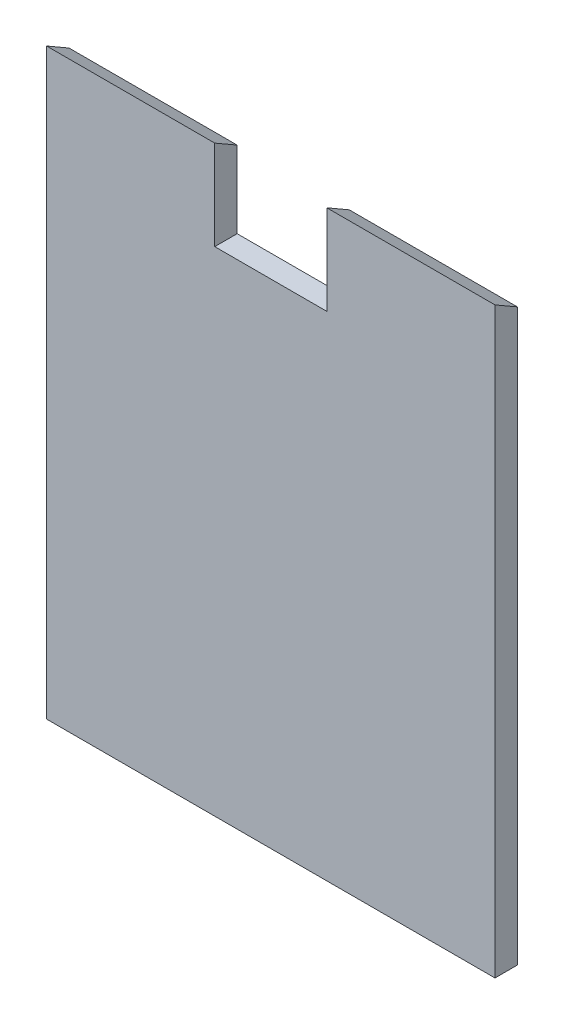
ISO-10303-21;
HEADER;
FILE_DESCRIPTION(('STEP AP214'),'2;1');
FILE_NAME('part.step','',(''),(''),'','','');
FILE_SCHEMA(('AUTOMOTIVE_DESIGN { 1 0 10303 214 1 1 1 1 }'));
ENDSEC;
DATA;
#1=APPLICATION_CONTEXT('core data for automotive mechanical design processes');
#2=APPLICATION_PROTOCOL_DEFINITION('international standard','automotive_design',2000,#1);
#3=PRODUCT_CONTEXT('',#1,'mechanical');
#4=PRODUCT('Part','Part','',(#3));
#5=PRODUCT_RELATED_PRODUCT_CATEGORY('part','',(#4));
#6=PRODUCT_DEFINITION_FORMATION('','',#4);
#7=PRODUCT_DEFINITION_CONTEXT('part definition',#1,'design');
#8=PRODUCT_DEFINITION('design','',#6,#7);
#9=PRODUCT_DEFINITION_SHAPE('','',#8);
#10=(LENGTH_UNIT() NAMED_UNIT(*) SI_UNIT(.MILLI.,.METRE.));
#11=(NAMED_UNIT(*) PLANE_ANGLE_UNIT() SI_UNIT($,.RADIAN.));
#12=(NAMED_UNIT(*) SI_UNIT($,.STERADIAN.) SOLID_ANGLE_UNIT());
#13=UNCERTAINTY_MEASURE_WITH_UNIT(LENGTH_MEASURE(1.E-05),#10,'distance_accuracy_value','');
#14=(GEOMETRIC_REPRESENTATION_CONTEXT(3) GLOBAL_UNCERTAINTY_ASSIGNED_CONTEXT((#13)) GLOBAL_UNIT_ASSIGNED_CONTEXT((#10,
#11,#12)) REPRESENTATION_CONTEXT('',''));
#15=CARTESIAN_POINT('',(0.,0.,0.));
#16=DIRECTION('',(0.,0.,1.));
#17=DIRECTION('',(1.,0.,0.));
#18=AXIS2_PLACEMENT_3D('',#15,#16,#17);
#19=CARTESIAN_POINT('',(-127.,-165.1,6.35));
#20=DIRECTION('',(1.,0.,0.));
#21=DIRECTION('',(0.,0.,-1.));
#22=AXIS2_PLACEMENT_3D('',#19,#20,#21);
#23=PLANE('',#22);
#24=DIRECTION('',(0.,-1.,0.));
#25=VECTOR('',#24,1.);
#26=CARTESIAN_POINT('',(-127.,-165.1,6.35));
#27=LINE('',#26,#25);
#28=CARTESIAN_POINT('',(-127.,165.1,6.35));
#29=VERTEX_POINT('',#28);
#30=CARTESIAN_POINT('',(-127.,-165.1,6.35));
#31=VERTEX_POINT('',#30);
#32=EDGE_CURVE('E107',#29,#31,#27,.T.);
#33=ORIENTED_EDGE('',*,*,#32,.F.);
#34=DIRECTION('',(0.,-0.500000000000001,-0.866025403784438));
#35=VECTOR('',#34,1.);
#36=CARTESIAN_POINT('',(-127.,165.1,6.35));
#37=LINE('',#36,#35);
#38=CARTESIAN_POINT('',(-127.,157.767651581292,-6.35000000000002));
#39=VERTEX_POINT('',#38);
#40=EDGE_CURVE('E96',#29,#39,#37,.T.);
#41=ORIENTED_EDGE('',*,*,#40,.T.);
#42=DIRECTION('',(0.,-1.,0.));
#43=VECTOR('',#42,1.);
#44=CARTESIAN_POINT('',(-127.,-165.1,-6.35));
#45=LINE('',#44,#43);
#46=CARTESIAN_POINT('',(-127.,-165.1,-6.35));
#47=VERTEX_POINT('',#46);
#48=EDGE_CURVE('E105',#39,#47,#45,.T.);
#49=ORIENTED_EDGE('',*,*,#48,.T.);
#50=DIRECTION('',(0.,0.,-1.));
#51=VECTOR('',#50,1.);
#52=CARTESIAN_POINT('',(-127.,-165.1,6.35));
#53=LINE('',#52,#51);
#54=EDGE_CURVE('E40',#31,#47,#53,.T.);
#55=ORIENTED_EDGE('',*,*,#54,.F.);
#56=EDGE_LOOP('',(#33,#41,#49,#55));
#57=FACE_BOUND('',#56,.T.);
#58=ADVANCED_FACE('F33',(#57),#23,.F.);
#59=CARTESIAN_POINT('',(127.,-165.1,6.35));
#60=DIRECTION('',(0.,1.,0.));
#61=DIRECTION('',(-1.,0.,0.));
#62=AXIS2_PLACEMENT_3D('',#59,#60,#61);
#63=PLANE('',#62);
#64=DIRECTION('',(1.,0.,0.));
#65=VECTOR('',#64,1.);
#66=CARTESIAN_POINT('',(127.,-165.1,-6.35));
#67=LINE('',#66,#65);
#68=CARTESIAN_POINT('',(127.,-165.1,-6.35));
#69=VERTEX_POINT('',#68);
#70=EDGE_CURVE('E113',#47,#69,#67,.T.);
#71=ORIENTED_EDGE('',*,*,#70,.T.);
#72=DIRECTION('',(0.,0.,-1.));
#73=VECTOR('',#72,1.);
#74=CARTESIAN_POINT('',(127.,-165.1,6.35));
#75=LINE('',#74,#73);
#76=CARTESIAN_POINT('',(127.,-165.1,6.35));
#77=VERTEX_POINT('',#76);
#78=EDGE_CURVE('E139',#77,#69,#75,.T.);
#79=ORIENTED_EDGE('',*,*,#78,.F.);
#80=DIRECTION('',(1.,0.,0.));
#81=VECTOR('',#80,1.);
#82=CARTESIAN_POINT('',(127.,-165.1,6.35));
#83=LINE('',#82,#81);
#84=EDGE_CURVE('E145',#31,#77,#83,.T.);
#85=ORIENTED_EDGE('',*,*,#84,.F.);
#86=ORIENTED_EDGE('',*,*,#54,.T.);
#87=EDGE_LOOP('',(#71,#79,#85,#86));
#88=FACE_BOUND('',#87,.T.);
#89=ADVANCED_FACE('F143',(#88),#63,.F.);
#90=CARTESIAN_POINT('',(127.,-165.1,6.35));
#91=DIRECTION('',(-1.,0.,0.));
#92=DIRECTION('',(0.,-1.,0.));
#93=AXIS2_PLACEMENT_3D('',#90,#91,#92);
#94=PLANE('',#93);
#95=DIRECTION('',(0.,1.,0.));
#96=VECTOR('',#95,1.);
#97=CARTESIAN_POINT('',(127.,-165.1,-6.35));
#98=LINE('',#97,#96);
#99=CARTESIAN_POINT('',(127.,157.767651581292,-6.35));
#100=VERTEX_POINT('',#99);
#101=EDGE_CURVE('E116',#69,#100,#98,.T.);
#102=ORIENTED_EDGE('',*,*,#101,.T.);
#103=DIRECTION('',(0.,-0.500000000000001,-0.866025403784438));
#104=VECTOR('',#103,1.);
#105=CARTESIAN_POINT('',(127.,165.1,6.35));
#106=LINE('',#105,#104);
#107=CARTESIAN_POINT('',(127.,165.1,6.35));
#108=VERTEX_POINT('',#107);
#109=EDGE_CURVE('E46',#108,#100,#106,.T.);
#110=ORIENTED_EDGE('',*,*,#109,.F.);
#111=DIRECTION('',(0.,1.,0.));
#112=VECTOR('',#111,1.);
#113=CARTESIAN_POINT('',(127.,-165.1,6.35));
#114=LINE('',#113,#112);
#115=EDGE_CURVE('E149',#77,#108,#114,.T.);
#116=ORIENTED_EDGE('',*,*,#115,.F.);
#117=ORIENTED_EDGE('',*,*,#78,.T.);
#118=EDGE_LOOP('',(#102,#110,#116,#117));
#119=FACE_BOUND('',#118,.T.);
#120=ADVANCED_FACE('F179',(#119),#94,.F.);
#121=CARTESIAN_POINT('',(31.75,114.3,6.35));
#122=DIRECTION('',(1.,0.,0.));
#123=DIRECTION('',(0.,1.,0.));
#124=AXIS2_PLACEMENT_3D('',#121,#122,#123);
#125=PLANE('',#124);
#126=DIRECTION('',(0.,-1.,0.));
#127=VECTOR('',#126,1.);
#128=CARTESIAN_POINT('',(31.75,114.3,6.35));
#129=LINE('',#128,#127);
#130=CARTESIAN_POINT('',(31.7499999999998,165.1,6.35));
#131=VERTEX_POINT('',#130);
#132=CARTESIAN_POINT('',(31.75,114.3,6.35));
#133=VERTEX_POINT('',#132);
#134=EDGE_CURVE('E158',#131,#133,#129,.T.);
#135=ORIENTED_EDGE('',*,*,#134,.F.);
#136=DIRECTION('',(0.,-0.500000000000001,-0.866025403784438));
#137=VECTOR('',#136,1.);
#138=CARTESIAN_POINT('',(31.7499999999999,152.4,-15.6470452561248));
#139=LINE('',#138,#137);
#140=CARTESIAN_POINT('',(31.7499999999999,157.767651581292,-6.35000000000002));
#141=VERTEX_POINT('',#140);
#142=EDGE_CURVE('E114',#131,#141,#139,.T.);
#143=ORIENTED_EDGE('',*,*,#142,.T.);
#144=DIRECTION('',(0.,-1.,0.));
#145=VECTOR('',#144,1.);
#146=CARTESIAN_POINT('',(31.75,114.3,-6.35));
#147=LINE('',#146,#145);
#148=CARTESIAN_POINT('',(31.75,114.3,-6.35));
#149=VERTEX_POINT('',#148);
#150=EDGE_CURVE('E126',#141,#149,#147,.T.);
#151=ORIENTED_EDGE('',*,*,#150,.T.);
#152=DIRECTION('',(0.,0.,-1.));
#153=VECTOR('',#152,1.);
#154=CARTESIAN_POINT('',(31.75,114.3,6.35));
#155=LINE('',#154,#153);
#156=EDGE_CURVE('E136',#133,#149,#155,.T.);
#157=ORIENTED_EDGE('',*,*,#156,.F.);
#158=EDGE_LOOP('',(#135,#143,#151,#157));
#159=FACE_BOUND('',#158,.T.);
#160=ADVANCED_FACE('F176',(#159),#125,.F.);
#161=CARTESIAN_POINT('',(-31.75,114.3,6.35));
#162=DIRECTION('',(0.,-1.,0.));
#163=DIRECTION('',(0.,0.,-1.));
#164=AXIS2_PLACEMENT_3D('',#161,#162,#163);
#165=PLANE('',#164);
#166=DIRECTION('',(-1.,0.,0.));
#167=VECTOR('',#166,1.);
#168=CARTESIAN_POINT('',(-31.75,114.3,-6.35));
#169=LINE('',#168,#167);
#170=CARTESIAN_POINT('',(-31.75,114.3,-6.35));
#171=VERTEX_POINT('',#170);
#172=EDGE_CURVE('E128',#149,#171,#169,.T.);
#173=ORIENTED_EDGE('',*,*,#172,.T.);
#174=DIRECTION('',(0.,0.,-1.));
#175=VECTOR('',#174,1.);
#176=CARTESIAN_POINT('',(-31.75,114.3,6.35));
#177=LINE('',#176,#175);
#178=CARTESIAN_POINT('',(-31.75,114.3,6.35));
#179=VERTEX_POINT('',#178);
#180=EDGE_CURVE('E133',#179,#171,#177,.T.);
#181=ORIENTED_EDGE('',*,*,#180,.F.);
#182=DIRECTION('',(-1.,0.,0.));
#183=VECTOR('',#182,1.);
#184=CARTESIAN_POINT('',(-31.75,114.3,6.35));
#185=LINE('',#184,#183);
#186=EDGE_CURVE('E159',#133,#179,#185,.T.);
#187=ORIENTED_EDGE('',*,*,#186,.F.);
#188=ORIENTED_EDGE('',*,*,#156,.T.);
#189=EDGE_LOOP('',(#173,#181,#187,#188));
#190=FACE_BOUND('',#189,.T.);
#191=ADVANCED_FACE('F172',(#190),#165,.F.);
#192=CARTESIAN_POINT('',(-31.75,114.3,6.35));
#193=DIRECTION('',(-1.,0.,0.));
#194=DIRECTION('',(0.,-1.,0.));
#195=AXIS2_PLACEMENT_3D('',#192,#193,#194);
#196=PLANE('',#195);
#197=DIRECTION('',(0.,1.,0.));
#198=VECTOR('',#197,1.);
#199=CARTESIAN_POINT('',(-31.75,114.3,-6.35));
#200=LINE('',#199,#198);
#201=CARTESIAN_POINT('',(-31.7500000000001,157.767651581292,-6.35));
#202=VERTEX_POINT('',#201);
#203=EDGE_CURVE('E130',#171,#202,#200,.T.);
#204=ORIENTED_EDGE('',*,*,#203,.T.);
#205=DIRECTION('',(0.,0.500000000000001,0.866025403784438));
#206=VECTOR('',#205,1.);
#207=CARTESIAN_POINT('',(-31.7500000000001,152.4,-15.6470452561248));
#208=LINE('',#207,#206);
#209=CARTESIAN_POINT('',(-31.7500000000002,165.1,6.35));
#210=VERTEX_POINT('',#209);
#211=EDGE_CURVE('E54',#202,#210,#208,.T.);
#212=ORIENTED_EDGE('',*,*,#211,.T.);
#213=DIRECTION('',(0.,1.,0.));
#214=VECTOR('',#213,1.);
#215=CARTESIAN_POINT('',(-31.75,114.3,6.35));
#216=LINE('',#215,#214);
#217=EDGE_CURVE('E121',#179,#210,#216,.T.);
#218=ORIENTED_EDGE('',*,*,#217,.F.);
#219=ORIENTED_EDGE('',*,*,#180,.T.);
#220=EDGE_LOOP('',(#204,#212,#218,#219));
#221=FACE_BOUND('',#220,.T.);
#222=ADVANCED_FACE('F166',(#221),#196,.F.);
#223=CARTESIAN_POINT('',(0.,0.,6.35));
#224=DIRECTION('',(0.,0.,-1.));
#225=DIRECTION('',(-1.,0.,0.));
#226=AXIS2_PLACEMENT_3D('',#223,#224,#225);
#227=PLANE('',#226);
#228=DIRECTION('',(-1.,0.,0.));
#229=VECTOR('',#228,1.);
#230=CARTESIAN_POINT('',(-31.7500000000002,165.1,6.35));
#231=LINE('',#230,#229);
#232=EDGE_CURVE('E132',#210,#29,#231,.T.);
#233=ORIENTED_EDGE('',*,*,#232,.T.);
#234=ORIENTED_EDGE('',*,*,#32,.T.);
#235=ORIENTED_EDGE('',*,*,#84,.T.);
#236=ORIENTED_EDGE('',*,*,#115,.T.);
#237=DIRECTION('',(-1.,0.,0.));
#238=VECTOR('',#237,1.);
#239=CARTESIAN_POINT('',(127.,165.1,6.35));
#240=LINE('',#239,#238);
#241=EDGE_CURVE('E151',#108,#131,#240,.T.);
#242=ORIENTED_EDGE('',*,*,#241,.T.);
#243=ORIENTED_EDGE('',*,*,#134,.T.);
#244=ORIENTED_EDGE('',*,*,#186,.T.);
#245=ORIENTED_EDGE('',*,*,#217,.T.);
#246=EDGE_LOOP('',(#233,#234,#235,#236,#242,#243,#244,#245));
#247=FACE_BOUND('',#246,.T.);
#248=ADVANCED_FACE('F164',(#247),#227,.F.);
#249=CARTESIAN_POINT('',(0.,0.,-6.35));
#250=DIRECTION('',(0.,0.,-1.));
#251=DIRECTION('',(-1.,0.,0.));
#252=AXIS2_PLACEMENT_3D('',#249,#250,#251);
#253=PLANE('',#252);
#254=DIRECTION('',(-1.,0.,0.));
#255=VECTOR('',#254,1.);
#256=CARTESIAN_POINT('',(0.,157.767651581292,-6.35));
#257=LINE('',#256,#255);
#258=EDGE_CURVE('E11',#100,#141,#257,.T.);
#259=ORIENTED_EDGE('',*,*,#258,.F.);
#260=ORIENTED_EDGE('',*,*,#101,.F.);
#261=ORIENTED_EDGE('',*,*,#70,.F.);
#262=ORIENTED_EDGE('',*,*,#48,.F.);
#263=DIRECTION('',(1.,0.,0.));
#264=VECTOR('',#263,1.);
#265=CARTESIAN_POINT('',(-127.,157.767651581292,-6.35000000000002));
#266=LINE('',#265,#264);
#267=EDGE_CURVE('E93',#39,#202,#266,.T.);
#268=ORIENTED_EDGE('',*,*,#267,.T.);
#269=ORIENTED_EDGE('',*,*,#203,.F.);
#270=ORIENTED_EDGE('',*,*,#172,.F.);
#271=ORIENTED_EDGE('',*,*,#150,.F.);
#272=EDGE_LOOP('',(#259,#260,#261,#262,#268,#269,#270,#271));
#273=FACE_BOUND('',#272,.T.);
#274=ADVANCED_FACE('F111',(#273),#253,.T.);
#275=CARTESIAN_POINT('',(-127.,165.1,6.35));
#276=DIRECTION('',(0.,-0.866025403784438,0.500000000000001));
#277=DIRECTION('',(0.,-0.500000000000001,-0.866025403784438));
#278=AXIS2_PLACEMENT_3D('',#275,#276,#277);
#279=PLANE('',#278);
#280=ORIENTED_EDGE('',*,*,#267,.F.);
#281=ORIENTED_EDGE('',*,*,#40,.F.);
#282=ORIENTED_EDGE('',*,*,#232,.F.);
#283=ORIENTED_EDGE('',*,*,#211,.F.);
#284=EDGE_LOOP('',(#280,#281,#282,#283));
#285=FACE_BOUND('',#284,.T.);
#286=ADVANCED_FACE('F95',(#285),#279,.F.);
#287=ORIENTED_EDGE('',*,*,#241,.F.);
#288=ORIENTED_EDGE('',*,*,#109,.T.);
#289=ORIENTED_EDGE('',*,*,#258,.T.);
#290=ORIENTED_EDGE('',*,*,#142,.F.);
#291=EDGE_LOOP('',(#287,#288,#289,#290));
#292=FACE_BOUND('',#291,.T.);
#293=ADVANCED_FACE('F177',(#292),#279,.F.);
#294=CLOSED_SHELL('',(#58,#89,#120,#160,#191,#222,#248,#274,#286,#293));
#295=MANIFOLD_SOLID_BREP('B2',#294);
#296=ADVANCED_BREP_SHAPE_REPRESENTATION('',(#18,#295),#14);
#297=SHAPE_DEFINITION_REPRESENTATION(#9,#296);
ENDSEC;
END-ISO-10303-21;
